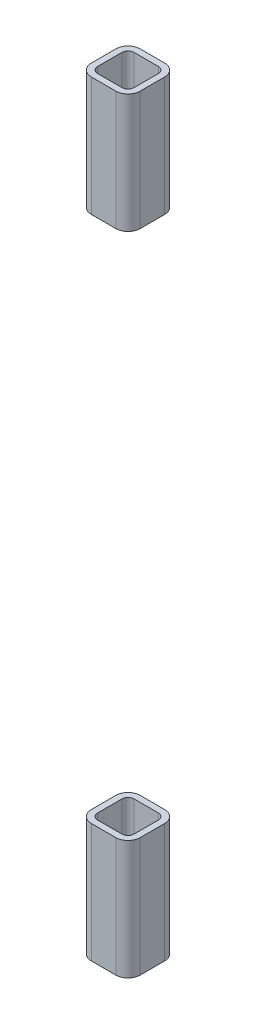
ISO-10303-21;
HEADER;
FILE_DESCRIPTION(('STEP AP214'),'2;1');
FILE_NAME('part.step','',(''),(''),'','','');
FILE_SCHEMA(('AUTOMOTIVE_DESIGN { 1 0 10303 214 1 1 1 1 }'));
ENDSEC;
DATA;
#1=APPLICATION_CONTEXT('core data for automotive mechanical design processes');
#2=APPLICATION_PROTOCOL_DEFINITION('international standard','automotive_design',2000,#1);
#3=PRODUCT_CONTEXT('',#1,'mechanical');
#4=PRODUCT('Part','Part','',(#3));
#5=PRODUCT_RELATED_PRODUCT_CATEGORY('part','',(#4));
#6=PRODUCT_DEFINITION_FORMATION('','',#4);
#7=PRODUCT_DEFINITION_CONTEXT('part definition',#1,'design');
#8=PRODUCT_DEFINITION('design','',#6,#7);
#9=PRODUCT_DEFINITION_SHAPE('','',#8);
#10=(LENGTH_UNIT() NAMED_UNIT(*) SI_UNIT(.MILLI.,.METRE.));
#11=(NAMED_UNIT(*) PLANE_ANGLE_UNIT() SI_UNIT($,.RADIAN.));
#12=(NAMED_UNIT(*) SI_UNIT($,.STERADIAN.) SOLID_ANGLE_UNIT());
#13=UNCERTAINTY_MEASURE_WITH_UNIT(LENGTH_MEASURE(1.E-05),#10,'distance_accuracy_value','');
#14=(GEOMETRIC_REPRESENTATION_CONTEXT(3) GLOBAL_UNCERTAINTY_ASSIGNED_CONTEXT((#13)) GLOBAL_UNIT_ASSIGNED_CONTEXT((#10,
#11,#12)) REPRESENTATION_CONTEXT('',''));
#15=CARTESIAN_POINT('',(0.,0.,0.));
#16=DIRECTION('',(0.,0.,1.));
#17=DIRECTION('',(1.,0.,0.));
#18=AXIS2_PLACEMENT_3D('',#15,#16,#17);
#19=CARTESIAN_POINT('',(-12.7,798.4,12.7));
#20=DIRECTION('',(0.,-1.,0.));
#21=DIRECTION('',(0.,0.,-1.));
#22=AXIS2_PLACEMENT_3D('',#19,#20,#21);
#23=CYLINDRICAL_SURFACE('',#22,12.7);
#24=DIRECTION('',(0.,-1.,0.));
#25=VECTOR('',#24,1.);
#26=CARTESIAN_POINT('',(-25.4,798.4,12.7));
#27=LINE('',#26,#25);
#28=CARTESIAN_POINT('',(-25.4,798.4,12.7));
#29=VERTEX_POINT('',#28);
#30=CARTESIAN_POINT('',(-25.4,674.2,12.7));
#31=VERTEX_POINT('',#30);
#32=EDGE_CURVE('E220',#29,#31,#27,.T.);
#33=ORIENTED_EDGE('',*,*,#32,.T.);
#34=CARTESIAN_POINT('',(-12.7,674.2,12.7));
#35=DIRECTION('',(0.,1.,0.));
#36=DIRECTION('',(0.,0.,1.));
#37=AXIS2_PLACEMENT_3D('',#34,#35,#36);
#38=CIRCLE('',#37,12.7);
#39=CARTESIAN_POINT('',(-12.7,674.2,25.4));
#40=VERTEX_POINT('',#39);
#41=EDGE_CURVE('E91',#31,#40,#38,.T.);
#42=ORIENTED_EDGE('',*,*,#41,.T.);
#43=DIRECTION('',(0.,-1.,0.));
#44=VECTOR('',#43,1.);
#45=CARTESIAN_POINT('',(-12.7,798.4,25.4));
#46=LINE('',#45,#44);
#47=CARTESIAN_POINT('',(-12.7,798.4,25.4));
#48=VERTEX_POINT('',#47);
#49=EDGE_CURVE('E273',#48,#40,#46,.T.);
#50=ORIENTED_EDGE('',*,*,#49,.F.);
#51=CARTESIAN_POINT('',(-12.7,798.4,12.7));
#52=DIRECTION('',(0.,1.,0.));
#53=DIRECTION('',(0.,0.,1.));
#54=AXIS2_PLACEMENT_3D('',#51,#52,#53);
#55=CIRCLE('',#54,12.7);
#56=EDGE_CURVE('E255',#29,#48,#55,.T.);
#57=ORIENTED_EDGE('',*,*,#56,.F.);
#58=EDGE_LOOP('',(#33,#42,#50,#57));
#59=FACE_BOUND('',#58,.T.);
#60=ADVANCED_FACE('F74',(#59),#23,.T.);
#61=CARTESIAN_POINT('',(-12.7,798.4,25.4));
#62=DIRECTION('',(0.,0.,-1.));
#63=DIRECTION('',(-1.,0.,0.));
#64=AXIS2_PLACEMENT_3D('',#61,#62,#63);
#65=PLANE('',#64);
#66=ORIENTED_EDGE('',*,*,#49,.T.);
#67=DIRECTION('',(-1.,0.,0.));
#68=VECTOR('',#67,1.);
#69=CARTESIAN_POINT('',(0.,674.2,25.4));
#70=LINE('',#69,#68);
#71=CARTESIAN_POINT('',(12.7,674.2,25.4));
#72=VERTEX_POINT('',#71);
#73=EDGE_CURVE('E13',#72,#40,#70,.T.);
#74=ORIENTED_EDGE('',*,*,#73,.F.);
#75=DIRECTION('',(0.,-1.,0.));
#76=VECTOR('',#75,1.);
#77=CARTESIAN_POINT('',(12.7,798.4,25.4));
#78=LINE('',#77,#76);
#79=CARTESIAN_POINT('',(12.7,798.4,25.4));
#80=VERTEX_POINT('',#79);
#81=EDGE_CURVE('E274',#80,#72,#78,.T.);
#82=ORIENTED_EDGE('',*,*,#81,.F.);
#83=DIRECTION('',(1.,0.,0.));
#84=VECTOR('',#83,1.);
#85=CARTESIAN_POINT('',(-12.7,798.4,25.4));
#86=LINE('',#85,#84);
#87=EDGE_CURVE('E306',#48,#80,#86,.T.);
#88=ORIENTED_EDGE('',*,*,#87,.F.);
#89=EDGE_LOOP('',(#66,#74,#82,#88));
#90=FACE_BOUND('',#89,.T.);
#91=ADVANCED_FACE('F305',(#90),#65,.F.);
#92=CARTESIAN_POINT('',(12.7,798.4,12.7));
#93=DIRECTION('',(0.,-1.,0.));
#94=DIRECTION('',(0.,0.,-1.));
#95=AXIS2_PLACEMENT_3D('',#92,#93,#94);
#96=CYLINDRICAL_SURFACE('',#95,12.7);
#97=ORIENTED_EDGE('',*,*,#81,.T.);
#98=CARTESIAN_POINT('',(12.7,674.2,12.7));
#99=DIRECTION('',(0.,1.,0.));
#100=DIRECTION('',(0.,0.,1.));
#101=AXIS2_PLACEMENT_3D('',#98,#99,#100);
#102=CIRCLE('',#101,12.7);
#103=CARTESIAN_POINT('',(25.3999999999999,674.2,12.7));
#104=VERTEX_POINT('',#103);
#105=EDGE_CURVE('E206',#72,#104,#102,.T.);
#106=ORIENTED_EDGE('',*,*,#105,.T.);
#107=DIRECTION('',(0.,-1.,0.));
#108=VECTOR('',#107,1.);
#109=CARTESIAN_POINT('',(25.4,798.4,12.7));
#110=LINE('',#109,#108);
#111=CARTESIAN_POINT('',(25.4,798.4,12.7));
#112=VERTEX_POINT('',#111);
#113=EDGE_CURVE('E200',#112,#104,#110,.T.);
#114=ORIENTED_EDGE('',*,*,#113,.F.);
#115=CARTESIAN_POINT('',(12.7,798.4,12.7));
#116=DIRECTION('',(0.,1.,0.));
#117=DIRECTION('',(0.,0.,1.));
#118=AXIS2_PLACEMENT_3D('',#115,#116,#117);
#119=CIRCLE('',#118,12.7);
#120=EDGE_CURVE('E302',#80,#112,#119,.T.);
#121=ORIENTED_EDGE('',*,*,#120,.F.);
#122=EDGE_LOOP('',(#97,#106,#114,#121));
#123=FACE_BOUND('',#122,.T.);
#124=ADVANCED_FACE('F301',(#123),#96,.T.);
#125=CARTESIAN_POINT('',(25.4,798.4,-12.7));
#126=DIRECTION('',(-1.,0.,0.));
#127=DIRECTION('',(0.,0.,1.));
#128=AXIS2_PLACEMENT_3D('',#125,#126,#127);
#129=PLANE('',#128);
#130=ORIENTED_EDGE('',*,*,#113,.T.);
#131=DIRECTION('',(0.,0.,1.));
#132=VECTOR('',#131,1.);
#133=CARTESIAN_POINT('',(25.3999999999999,674.2,-75.6));
#134=LINE('',#133,#132);
#135=CARTESIAN_POINT('',(25.3999999999999,674.2,-12.7));
#136=VERTEX_POINT('',#135);
#137=EDGE_CURVE('E83',#136,#104,#134,.T.);
#138=ORIENTED_EDGE('',*,*,#137,.F.);
#139=DIRECTION('',(0.,-1.,0.));
#140=VECTOR('',#139,1.);
#141=CARTESIAN_POINT('',(25.4,798.4,-12.7));
#142=LINE('',#141,#140);
#143=CARTESIAN_POINT('',(25.4,798.4,-12.7));
#144=VERTEX_POINT('',#143);
#145=EDGE_CURVE('E191',#144,#136,#142,.T.);
#146=ORIENTED_EDGE('',*,*,#145,.F.);
#147=DIRECTION('',(0.,0.,-1.));
#148=VECTOR('',#147,1.);
#149=CARTESIAN_POINT('',(25.4,798.4,-12.7));
#150=LINE('',#149,#148);
#151=EDGE_CURVE('E324',#112,#144,#150,.T.);
#152=ORIENTED_EDGE('',*,*,#151,.F.);
#153=EDGE_LOOP('',(#130,#138,#146,#152));
#154=FACE_BOUND('',#153,.T.);
#155=ADVANCED_FACE('F196',(#154),#129,.F.);
#156=CARTESIAN_POINT('',(12.7,798.4,-12.7));
#157=DIRECTION('',(0.,-1.,0.));
#158=DIRECTION('',(0.,0.,-1.));
#159=AXIS2_PLACEMENT_3D('',#156,#157,#158);
#160=CYLINDRICAL_SURFACE('',#159,12.7);
#161=ORIENTED_EDGE('',*,*,#145,.T.);
#162=CARTESIAN_POINT('',(12.7,674.2,-12.7));
#163=DIRECTION('',(0.,1.,0.));
#164=DIRECTION('',(0.,0.,1.));
#165=AXIS2_PLACEMENT_3D('',#162,#163,#164);
#166=CIRCLE('',#165,12.7);
#167=CARTESIAN_POINT('',(12.7,674.2,-25.4));
#168=VERTEX_POINT('',#167);
#169=EDGE_CURVE('E179',#136,#168,#166,.T.);
#170=ORIENTED_EDGE('',*,*,#169,.T.);
#171=DIRECTION('',(0.,-1.,0.));
#172=VECTOR('',#171,1.);
#173=CARTESIAN_POINT('',(12.7,798.4,-25.4));
#174=LINE('',#173,#172);
#175=CARTESIAN_POINT('',(12.7,798.4,-25.4));
#176=VERTEX_POINT('',#175);
#177=EDGE_CURVE('E190',#176,#168,#174,.T.);
#178=ORIENTED_EDGE('',*,*,#177,.F.);
#179=CARTESIAN_POINT('',(12.7,798.4,-12.7));
#180=DIRECTION('',(0.,1.,0.));
#181=DIRECTION('',(0.,0.,1.));
#182=AXIS2_PLACEMENT_3D('',#179,#180,#181);
#183=CIRCLE('',#182,12.7);
#184=EDGE_CURVE('E204',#144,#176,#183,.T.);
#185=ORIENTED_EDGE('',*,*,#184,.F.);
#186=EDGE_LOOP('',(#161,#170,#178,#185));
#187=FACE_BOUND('',#186,.T.);
#188=ADVANCED_FACE('F203',(#187),#160,.T.);
#189=CARTESIAN_POINT('',(12.7,798.4,-25.4));
#190=DIRECTION('',(0.,0.,1.));
#191=DIRECTION('',(1.,0.,0.));
#192=AXIS2_PLACEMENT_3D('',#189,#190,#191);
#193=PLANE('',#192);
#194=ORIENTED_EDGE('',*,*,#177,.T.);
#195=DIRECTION('',(-1.,0.,0.));
#196=VECTOR('',#195,1.);
#197=CARTESIAN_POINT('',(12.7,674.2,-25.4));
#198=LINE('',#197,#196);
#199=CARTESIAN_POINT('',(-12.7,674.2,-25.4));
#200=VERTEX_POINT('',#199);
#201=EDGE_CURVE('E185',#168,#200,#198,.T.);
#202=ORIENTED_EDGE('',*,*,#201,.T.);
#203=DIRECTION('',(0.,-1.,0.));
#204=VECTOR('',#203,1.);
#205=CARTESIAN_POINT('',(-12.7,798.4,-25.4));
#206=LINE('',#205,#204);
#207=CARTESIAN_POINT('',(-12.7,798.4,-25.4));
#208=VERTEX_POINT('',#207);
#209=EDGE_CURVE('E211',#208,#200,#206,.T.);
#210=ORIENTED_EDGE('',*,*,#209,.F.);
#211=DIRECTION('',(-1.,0.,0.));
#212=VECTOR('',#211,1.);
#213=CARTESIAN_POINT('',(12.7,798.4,-25.4));
#214=LINE('',#213,#212);
#215=EDGE_CURVE('E321',#176,#208,#214,.T.);
#216=ORIENTED_EDGE('',*,*,#215,.F.);
#217=EDGE_LOOP('',(#194,#202,#210,#216));
#218=FACE_BOUND('',#217,.T.);
#219=ADVANCED_FACE('F334',(#218),#193,.F.);
#220=CARTESIAN_POINT('',(-12.7,798.4,-12.7));
#221=DIRECTION('',(0.,-1.,0.));
#222=DIRECTION('',(0.,0.,-1.));
#223=AXIS2_PLACEMENT_3D('',#220,#221,#222);
#224=CYLINDRICAL_SURFACE('',#223,12.7);
#225=ORIENTED_EDGE('',*,*,#209,.T.);
#226=CARTESIAN_POINT('',(-12.7,674.2,-12.7));
#227=DIRECTION('',(0.,1.,0.));
#228=DIRECTION('',(0.,0.,1.));
#229=AXIS2_PLACEMENT_3D('',#226,#227,#228);
#230=CIRCLE('',#229,12.7);
#231=CARTESIAN_POINT('',(-25.4,674.2,-12.7));
#232=VERTEX_POINT('',#231);
#233=EDGE_CURVE('E214',#200,#232,#230,.T.);
#234=ORIENTED_EDGE('',*,*,#233,.T.);
#235=DIRECTION('',(0.,-1.,0.));
#236=VECTOR('',#235,1.);
#237=CARTESIAN_POINT('',(-25.4,798.4,-12.7));
#238=LINE('',#237,#236);
#239=CARTESIAN_POINT('',(-25.4,798.4,-12.7));
#240=VERTEX_POINT('',#239);
#241=EDGE_CURVE('E215',#240,#232,#238,.T.);
#242=ORIENTED_EDGE('',*,*,#241,.F.);
#243=CARTESIAN_POINT('',(-12.7,798.4,-12.7));
#244=DIRECTION('',(0.,1.,0.));
#245=DIRECTION('',(0.,0.,1.));
#246=AXIS2_PLACEMENT_3D('',#243,#244,#245);
#247=CIRCLE('',#246,12.7);
#248=EDGE_CURVE('E319',#208,#240,#247,.T.);
#249=ORIENTED_EDGE('',*,*,#248,.F.);
#250=EDGE_LOOP('',(#225,#234,#242,#249));
#251=FACE_BOUND('',#250,.T.);
#252=ADVANCED_FACE('F332',(#251),#224,.T.);
#253=CARTESIAN_POINT('',(12.7,798.4,12.7));
#254=DIRECTION('',(0.,-1.,0.));
#255=DIRECTION('',(0.,0.,-1.));
#256=AXIS2_PLACEMENT_3D('',#253,#254,#255);
#257=CYLINDRICAL_SURFACE('',#256,6.35);
#258=CARTESIAN_POINT('',(12.7,674.2,12.7));
#259=DIRECTION('',(0.,1.,0.));
#260=DIRECTION('',(0.,0.,1.));
#261=AXIS2_PLACEMENT_3D('',#258,#259,#260);
#262=CIRCLE('',#261,6.35);
#263=CARTESIAN_POINT('',(12.7,674.2,19.05));
#264=VERTEX_POINT('',#263);
#265=CARTESIAN_POINT('',(19.05,674.2,12.7));
#266=VERTEX_POINT('',#265);
#267=EDGE_CURVE('E279',#264,#266,#262,.T.);
#268=ORIENTED_EDGE('',*,*,#267,.F.);
#269=DIRECTION('',(0.,-1.,0.));
#270=VECTOR('',#269,1.);
#271=CARTESIAN_POINT('',(12.7,798.4,19.05));
#272=LINE('',#271,#270);
#273=CARTESIAN_POINT('',(12.7,798.4,19.05));
#274=VERTEX_POINT('',#273);
#275=EDGE_CURVE('E223',#274,#264,#272,.T.);
#276=ORIENTED_EDGE('',*,*,#275,.F.);
#277=CARTESIAN_POINT('',(12.7,798.4,12.7));
#278=DIRECTION('',(0.,1.,0.));
#279=DIRECTION('',(0.,0.,1.));
#280=AXIS2_PLACEMENT_3D('',#277,#278,#279);
#281=CIRCLE('',#280,6.35);
#282=CARTESIAN_POINT('',(19.05,798.4,12.7));
#283=VERTEX_POINT('',#282);
#284=EDGE_CURVE('E269',#274,#283,#281,.T.);
#285=ORIENTED_EDGE('',*,*,#284,.T.);
#286=DIRECTION('',(0.,-1.,0.));
#287=VECTOR('',#286,1.);
#288=CARTESIAN_POINT('',(19.05,798.4,12.7));
#289=LINE('',#288,#287);
#290=EDGE_CURVE('E77',#283,#266,#289,.T.);
#291=ORIENTED_EDGE('',*,*,#290,.T.);
#292=EDGE_LOOP('',(#268,#276,#285,#291));
#293=FACE_BOUND('',#292,.T.);
#294=ADVANCED_FACE('F341',(#293),#257,.F.);
#295=CARTESIAN_POINT('',(-12.7,798.4,19.05));
#296=DIRECTION('',(0.,0.,-1.));
#297=DIRECTION('',(-1.,0.,0.));
#298=AXIS2_PLACEMENT_3D('',#295,#296,#297);
#299=PLANE('',#298);
#300=DIRECTION('',(1.,0.,0.));
#301=VECTOR('',#300,1.);
#302=CARTESIAN_POINT('',(-12.7,674.2,19.05));
#303=LINE('',#302,#301);
#304=CARTESIAN_POINT('',(-12.7,674.2,19.05));
#305=VERTEX_POINT('',#304);
#306=EDGE_CURVE('E201',#305,#264,#303,.T.);
#307=ORIENTED_EDGE('',*,*,#306,.F.);
#308=DIRECTION('',(0.,-1.,0.));
#309=VECTOR('',#308,1.);
#310=CARTESIAN_POINT('',(-12.7,798.4,19.05));
#311=LINE('',#310,#309);
#312=CARTESIAN_POINT('',(-12.7,798.4,19.05));
#313=VERTEX_POINT('',#312);
#314=EDGE_CURVE('E228',#313,#305,#311,.T.);
#315=ORIENTED_EDGE('',*,*,#314,.F.);
#316=DIRECTION('',(1.,0.,0.));
#317=VECTOR('',#316,1.);
#318=CARTESIAN_POINT('',(-12.7,798.4,19.05));
#319=LINE('',#318,#317);
#320=EDGE_CURVE('E227',#313,#274,#319,.T.);
#321=ORIENTED_EDGE('',*,*,#320,.T.);
#322=ORIENTED_EDGE('',*,*,#275,.T.);
#323=EDGE_LOOP('',(#307,#315,#321,#322));
#324=FACE_BOUND('',#323,.T.);
#325=ADVANCED_FACE('F383',(#324),#299,.T.);
#326=CARTESIAN_POINT('',(-12.7,798.4,12.7));
#327=DIRECTION('',(0.,-1.,0.));
#328=DIRECTION('',(0.,0.,-1.));
#329=AXIS2_PLACEMENT_3D('',#326,#327,#328);
#330=CYLINDRICAL_SURFACE('',#329,6.35);
#331=CARTESIAN_POINT('',(-12.7,674.2,12.7));
#332=DIRECTION('',(0.,1.,0.));
#333=DIRECTION('',(0.,0.,1.));
#334=AXIS2_PLACEMENT_3D('',#331,#332,#333);
#335=CIRCLE('',#334,6.35);
#336=CARTESIAN_POINT('',(-19.05,674.2,12.7));
#337=VERTEX_POINT('',#336);
#338=EDGE_CURVE('E285',#337,#305,#335,.T.);
#339=ORIENTED_EDGE('',*,*,#338,.F.);
#340=DIRECTION('',(0.,-1.,0.));
#341=VECTOR('',#340,1.);
#342=CARTESIAN_POINT('',(-19.05,798.4,12.7));
#343=LINE('',#342,#341);
#344=CARTESIAN_POINT('',(-19.05,798.4,12.7));
#345=VERTEX_POINT('',#344);
#346=EDGE_CURVE('E232',#345,#337,#343,.T.);
#347=ORIENTED_EDGE('',*,*,#346,.F.);
#348=CARTESIAN_POINT('',(-12.7,798.4,12.7));
#349=DIRECTION('',(0.,1.,0.));
#350=DIRECTION('',(0.,0.,1.));
#351=AXIS2_PLACEMENT_3D('',#348,#349,#350);
#352=CIRCLE('',#351,6.35);
#353=EDGE_CURVE('E226',#345,#313,#352,.T.);
#354=ORIENTED_EDGE('',*,*,#353,.T.);
#355=ORIENTED_EDGE('',*,*,#314,.T.);
#356=EDGE_LOOP('',(#339,#347,#354,#355));
#357=FACE_BOUND('',#356,.T.);
#358=ADVANCED_FACE('F393',(#357),#330,.F.);
#359=CARTESIAN_POINT('',(-19.05,798.4,12.7));
#360=DIRECTION('',(1.,0.,0.));
#361=DIRECTION('',(0.,0.,-1.));
#362=AXIS2_PLACEMENT_3D('',#359,#360,#361);
#363=PLANE('',#362);
#364=DIRECTION('',(0.,0.,1.));
#365=VECTOR('',#364,1.);
#366=CARTESIAN_POINT('',(-19.05,674.2,12.7));
#367=LINE('',#366,#365);
#368=CARTESIAN_POINT('',(-19.05,674.2,-12.7));
#369=VERTEX_POINT('',#368);
#370=EDGE_CURVE('E287',#369,#337,#367,.T.);
#371=ORIENTED_EDGE('',*,*,#370,.F.);
#372=DIRECTION('',(0.,-1.,0.));
#373=VECTOR('',#372,1.);
#374=CARTESIAN_POINT('',(-19.05,798.4,-12.7));
#375=LINE('',#374,#373);
#376=CARTESIAN_POINT('',(-19.05,798.4,-12.7));
#377=VERTEX_POINT('',#376);
#378=EDGE_CURVE('E236',#377,#369,#375,.T.);
#379=ORIENTED_EDGE('',*,*,#378,.F.);
#380=DIRECTION('',(0.,0.,1.));
#381=VECTOR('',#380,1.);
#382=CARTESIAN_POINT('',(-19.05,798.4,12.7));
#383=LINE('',#382,#381);
#384=EDGE_CURVE('E231',#377,#345,#383,.T.);
#385=ORIENTED_EDGE('',*,*,#384,.T.);
#386=ORIENTED_EDGE('',*,*,#346,.T.);
#387=EDGE_LOOP('',(#371,#379,#385,#386));
#388=FACE_BOUND('',#387,.T.);
#389=ADVANCED_FACE('F403',(#388),#363,.T.);
#390=CARTESIAN_POINT('',(-12.7,798.4,-12.7));
#391=DIRECTION('',(0.,-1.,0.));
#392=DIRECTION('',(0.,0.,-1.));
#393=AXIS2_PLACEMENT_3D('',#390,#391,#392);
#394=CYLINDRICAL_SURFACE('',#393,6.35);
#395=CARTESIAN_POINT('',(-12.7,674.2,-12.7));
#396=DIRECTION('',(0.,1.,0.));
#397=DIRECTION('',(0.,0.,1.));
#398=AXIS2_PLACEMENT_3D('',#395,#396,#397);
#399=CIRCLE('',#398,6.35);
#400=CARTESIAN_POINT('',(-12.7,674.2,-19.05));
#401=VERTEX_POINT('',#400);
#402=EDGE_CURVE('E289',#401,#369,#399,.T.);
#403=ORIENTED_EDGE('',*,*,#402,.F.);
#404=DIRECTION('',(0.,-1.,0.));
#405=VECTOR('',#404,1.);
#406=CARTESIAN_POINT('',(-12.7,798.4,-19.05));
#407=LINE('',#406,#405);
#408=CARTESIAN_POINT('',(-12.7,798.4,-19.05));
#409=VERTEX_POINT('',#408);
#410=EDGE_CURVE('E240',#409,#401,#407,.T.);
#411=ORIENTED_EDGE('',*,*,#410,.F.);
#412=CARTESIAN_POINT('',(-12.7,798.4,-12.7));
#413=DIRECTION('',(0.,1.,0.));
#414=DIRECTION('',(0.,0.,1.));
#415=AXIS2_PLACEMENT_3D('',#412,#413,#414);
#416=CIRCLE('',#415,6.35);
#417=EDGE_CURVE('E235',#409,#377,#416,.T.);
#418=ORIENTED_EDGE('',*,*,#417,.T.);
#419=ORIENTED_EDGE('',*,*,#378,.T.);
#420=EDGE_LOOP('',(#403,#411,#418,#419));
#421=FACE_BOUND('',#420,.T.);
#422=ADVANCED_FACE('F413',(#421),#394,.F.);
#423=CARTESIAN_POINT('',(12.7,798.4,-19.05));
#424=DIRECTION('',(0.,0.,1.));
#425=DIRECTION('',(1.,0.,0.));
#426=AXIS2_PLACEMENT_3D('',#423,#424,#425);
#427=PLANE('',#426);
#428=DIRECTION('',(-1.,0.,0.));
#429=VECTOR('',#428,1.);
#430=CARTESIAN_POINT('',(12.7,674.2,-19.05));
#431=LINE('',#430,#429);
#432=CARTESIAN_POINT('',(12.7,674.2,-19.05));
#433=VERTEX_POINT('',#432);
#434=EDGE_CURVE('E291',#433,#401,#431,.T.);
#435=ORIENTED_EDGE('',*,*,#434,.F.);
#436=DIRECTION('',(0.,-1.,0.));
#437=VECTOR('',#436,1.);
#438=CARTESIAN_POINT('',(12.7,798.4,-19.05));
#439=LINE('',#438,#437);
#440=CARTESIAN_POINT('',(12.7,798.4,-19.05));
#441=VERTEX_POINT('',#440);
#442=EDGE_CURVE('E244',#441,#433,#439,.T.);
#443=ORIENTED_EDGE('',*,*,#442,.F.);
#444=DIRECTION('',(-1.,0.,0.));
#445=VECTOR('',#444,1.);
#446=CARTESIAN_POINT('',(12.7,798.4,-19.05));
#447=LINE('',#446,#445);
#448=EDGE_CURVE('E239',#441,#409,#447,.T.);
#449=ORIENTED_EDGE('',*,*,#448,.T.);
#450=ORIENTED_EDGE('',*,*,#410,.T.);
#451=EDGE_LOOP('',(#435,#443,#449,#450));
#452=FACE_BOUND('',#451,.T.);
#453=ADVANCED_FACE('F423',(#452),#427,.T.);
#454=CARTESIAN_POINT('',(12.7,798.4,-12.7));
#455=DIRECTION('',(0.,-1.,0.));
#456=DIRECTION('',(0.,0.,-1.));
#457=AXIS2_PLACEMENT_3D('',#454,#455,#456);
#458=CYLINDRICAL_SURFACE('',#457,6.35);
#459=CARTESIAN_POINT('',(12.7,674.2,-12.7));
#460=DIRECTION('',(0.,1.,0.));
#461=DIRECTION('',(0.,0.,1.));
#462=AXIS2_PLACEMENT_3D('',#459,#460,#461);
#463=CIRCLE('',#462,6.35);
#464=CARTESIAN_POINT('',(19.05,674.2,-12.7));
#465=VERTEX_POINT('',#464);
#466=EDGE_CURVE('E293',#465,#433,#463,.T.);
#467=ORIENTED_EDGE('',*,*,#466,.F.);
#468=DIRECTION('',(0.,-1.,0.));
#469=VECTOR('',#468,1.);
#470=CARTESIAN_POINT('',(19.05,798.4,-12.7));
#471=LINE('',#470,#469);
#472=CARTESIAN_POINT('',(19.05,798.4,-12.7));
#473=VERTEX_POINT('',#472);
#474=EDGE_CURVE('E219',#473,#465,#471,.T.);
#475=ORIENTED_EDGE('',*,*,#474,.F.);
#476=CARTESIAN_POINT('',(12.7,798.4,-12.7));
#477=DIRECTION('',(0.,1.,0.));
#478=DIRECTION('',(0.,0.,1.));
#479=AXIS2_PLACEMENT_3D('',#476,#477,#478);
#480=CIRCLE('',#479,6.35);
#481=EDGE_CURVE('E243',#473,#441,#480,.T.);
#482=ORIENTED_EDGE('',*,*,#481,.T.);
#483=ORIENTED_EDGE('',*,*,#442,.T.);
#484=EDGE_LOOP('',(#467,#475,#482,#483));
#485=FACE_BOUND('',#484,.T.);
#486=ADVANCED_FACE('F433',(#485),#458,.F.);
#487=CARTESIAN_POINT('',(19.05,798.4,-12.7));
#488=DIRECTION('',(-1.,0.,0.));
#489=DIRECTION('',(0.,0.,1.));
#490=AXIS2_PLACEMENT_3D('',#487,#488,#489);
#491=PLANE('',#490);
#492=DIRECTION('',(0.,0.,-1.));
#493=VECTOR('',#492,1.);
#494=CARTESIAN_POINT('',(19.05,674.2,-12.7));
#495=LINE('',#494,#493);
#496=EDGE_CURVE('E282',#266,#465,#495,.T.);
#497=ORIENTED_EDGE('',*,*,#496,.F.);
#498=ORIENTED_EDGE('',*,*,#290,.F.);
#499=DIRECTION('',(0.,0.,-1.));
#500=VECTOR('',#499,1.);
#501=CARTESIAN_POINT('',(19.05,798.4,-12.7));
#502=LINE('',#501,#500);
#503=EDGE_CURVE('E246',#283,#473,#502,.T.);
#504=ORIENTED_EDGE('',*,*,#503,.T.);
#505=ORIENTED_EDGE('',*,*,#474,.T.);
#506=EDGE_LOOP('',(#497,#498,#504,#505));
#507=FACE_BOUND('',#506,.T.);
#508=ADVANCED_FACE('F443',(#507),#491,.T.);
#509=CARTESIAN_POINT('',(-25.4,798.4,12.7));
#510=DIRECTION('',(1.,0.,0.));
#511=DIRECTION('',(0.,0.,-1.));
#512=AXIS2_PLACEMENT_3D('',#509,#510,#511);
#513=PLANE('',#512);
#514=ORIENTED_EDGE('',*,*,#241,.T.);
#515=DIRECTION('',(0.,0.,1.));
#516=VECTOR('',#515,1.);
#517=CARTESIAN_POINT('',(-25.4,674.2,12.7));
#518=LINE('',#517,#516);
#519=EDGE_CURVE('E218',#232,#31,#518,.T.);
#520=ORIENTED_EDGE('',*,*,#519,.T.);
#521=ORIENTED_EDGE('',*,*,#32,.F.);
#522=DIRECTION('',(0.,0.,1.));
#523=VECTOR('',#522,1.);
#524=CARTESIAN_POINT('',(-25.4,798.4,12.7));
#525=LINE('',#524,#523);
#526=EDGE_CURVE('E283',#240,#29,#525,.T.);
#527=ORIENTED_EDGE('',*,*,#526,.F.);
#528=EDGE_LOOP('',(#514,#520,#521,#527));
#529=FACE_BOUND('',#528,.T.);
#530=ADVANCED_FACE('F314',(#529),#513,.F.);
#531=CARTESIAN_POINT('',(-12.7,798.4,12.7));
#532=DIRECTION('',(0.,1.,0.));
#533=DIRECTION('',(0.,0.,1.));
#534=AXIS2_PLACEMENT_3D('',#531,#532,#533);
#535=PLANE('',#534);
#536=ORIENTED_EDGE('',*,*,#284,.F.);
#537=ORIENTED_EDGE('',*,*,#320,.F.);
#538=ORIENTED_EDGE('',*,*,#353,.F.);
#539=ORIENTED_EDGE('',*,*,#384,.F.);
#540=ORIENTED_EDGE('',*,*,#417,.F.);
#541=ORIENTED_EDGE('',*,*,#448,.F.);
#542=ORIENTED_EDGE('',*,*,#481,.F.);
#543=ORIENTED_EDGE('',*,*,#503,.F.);
#544=EDGE_LOOP('',(#536,#537,#538,#539,#540,#541,#542,#543));
#545=FACE_BOUND('',#544,.T.);
#546=ORIENTED_EDGE('',*,*,#56,.T.);
#547=ORIENTED_EDGE('',*,*,#87,.T.);
#548=ORIENTED_EDGE('',*,*,#120,.T.);
#549=ORIENTED_EDGE('',*,*,#151,.T.);
#550=ORIENTED_EDGE('',*,*,#184,.T.);
#551=ORIENTED_EDGE('',*,*,#215,.T.);
#552=ORIENTED_EDGE('',*,*,#248,.T.);
#553=ORIENTED_EDGE('',*,*,#526,.T.);
#554=EDGE_LOOP('',(#546,#547,#548,#549,#550,#551,#552,#553));
#555=FACE_BOUND('',#554,.T.);
#556=ADVANCED_FACE('F327',(#545,#555),#535,.T.);
#557=CARTESIAN_POINT('',(0.,674.2,-75.6));
#558=DIRECTION('',(0.,1.,0.));
#559=DIRECTION('',(0.,0.,1.));
#560=AXIS2_PLACEMENT_3D('',#557,#558,#559);
#561=PLANE('',#560);
#562=ORIENTED_EDGE('',*,*,#267,.T.);
#563=ORIENTED_EDGE('',*,*,#496,.T.);
#564=ORIENTED_EDGE('',*,*,#466,.T.);
#565=ORIENTED_EDGE('',*,*,#434,.T.);
#566=ORIENTED_EDGE('',*,*,#402,.T.);
#567=ORIENTED_EDGE('',*,*,#370,.T.);
#568=ORIENTED_EDGE('',*,*,#338,.T.);
#569=ORIENTED_EDGE('',*,*,#306,.T.);
#570=EDGE_LOOP('',(#562,#563,#564,#565,#566,#567,#568,#569));
#571=FACE_BOUND('',#570,.T.);
#572=ORIENTED_EDGE('',*,*,#519,.F.);
#573=ORIENTED_EDGE('',*,*,#233,.F.);
#574=ORIENTED_EDGE('',*,*,#201,.F.);
#575=ORIENTED_EDGE('',*,*,#169,.F.);
#576=ORIENTED_EDGE('',*,*,#137,.T.);
#577=ORIENTED_EDGE('',*,*,#105,.F.);
#578=ORIENTED_EDGE('',*,*,#73,.T.);
#579=ORIENTED_EDGE('',*,*,#41,.F.);
#580=EDGE_LOOP('',(#572,#573,#574,#575,#576,#577,#578,#579));
#581=FACE_BOUND('',#580,.T.);
#582=ADVANCED_FACE('F181',(#571,#581),#561,.F.);
#583=CLOSED_SHELL('',(#60,#91,#124,#155,#188,#219,#252,#294,#325,#358,#389,#422,#453,#486,#508,
#530,#556,#582));
#584=MANIFOLD_SOLID_BREP('B2',#583);
#585=CARTESIAN_POINT('',(19.05,798.4,-12.7));
#586=DIRECTION('',(-1.,0.,0.));
#587=DIRECTION('',(0.,0.,1.));
#588=AXIS2_PLACEMENT_3D('',#585,#586,#587);
#589=PLANE('',#588);
#590=DIRECTION('',(0.,0.,1.));
#591=VECTOR('',#590,1.);
#592=CARTESIAN_POINT('',(19.05,124.2,-12.7));
#593=LINE('',#592,#591);
#594=CARTESIAN_POINT('',(19.05,124.2,-12.7));
#595=VERTEX_POINT('',#594);
#596=CARTESIAN_POINT('',(19.05,124.2,12.7));
#597=VERTEX_POINT('',#596);
#598=EDGE_CURVE('E761',#595,#597,#593,.T.);
#599=ORIENTED_EDGE('',*,*,#598,.F.);
#600=DIRECTION('',(0.,-1.,0.));
#601=VECTOR('',#600,1.);
#602=CARTESIAN_POINT('',(19.05,798.4,-12.7));
#603=LINE('',#602,#601);
#604=CARTESIAN_POINT('',(19.05,0.,-12.7));
#605=VERTEX_POINT('',#604);
#606=EDGE_CURVE('E649',#595,#605,#603,.T.);
#607=ORIENTED_EDGE('',*,*,#606,.T.);
#608=DIRECTION('',(0.,0.,-1.));
#609=VECTOR('',#608,1.);
#610=CARTESIAN_POINT('',(19.05,0.,-12.7));
#611=LINE('',#610,#609);
#612=CARTESIAN_POINT('',(19.05,0.,12.7));
#613=VERTEX_POINT('',#612);
#614=EDGE_CURVE('E715',#613,#605,#611,.T.);
#615=ORIENTED_EDGE('',*,*,#614,.F.);
#616=DIRECTION('',(0.,-1.,0.));
#617=VECTOR('',#616,1.);
#618=CARTESIAN_POINT('',(19.05,798.4,12.7));
#619=LINE('',#618,#617);
#620=EDGE_CURVE('E647',#597,#613,#619,.T.);
#621=ORIENTED_EDGE('',*,*,#620,.F.);
#622=EDGE_LOOP('',(#599,#607,#615,#621));
#623=FACE_BOUND('',#622,.T.);
#624=ADVANCED_FACE('F509',(#623),#589,.T.);
#625=CARTESIAN_POINT('',(12.7,798.4,-12.7));
#626=DIRECTION('',(0.,-1.,0.));
#627=DIRECTION('',(0.,0.,-1.));
#628=AXIS2_PLACEMENT_3D('',#625,#626,#627);
#629=CYLINDRICAL_SURFACE('',#628,6.35);
#630=CARTESIAN_POINT('',(12.7,124.2,-12.7));
#631=DIRECTION('',(0.,-1.,0.));
#632=DIRECTION('',(0.,0.,-1.));
#633=AXIS2_PLACEMENT_3D('',#630,#631,#632);
#634=CIRCLE('',#633,6.35);
#635=CARTESIAN_POINT('',(12.7,124.2,-19.05));
#636=VERTEX_POINT('',#635);
#637=EDGE_CURVE('E524',#636,#595,#634,.T.);
#638=ORIENTED_EDGE('',*,*,#637,.F.);
#639=DIRECTION('',(0.,-1.,0.));
#640=VECTOR('',#639,1.);
#641=CARTESIAN_POINT('',(12.7,798.4,-19.05));
#642=LINE('',#641,#640);
#643=CARTESIAN_POINT('',(12.7,0.,-19.05));
#644=VERTEX_POINT('',#643);
#645=EDGE_CURVE('E652',#636,#644,#642,.T.);
#646=ORIENTED_EDGE('',*,*,#645,.T.);
#647=CARTESIAN_POINT('',(12.7,0.,-12.7));
#648=DIRECTION('',(0.,1.,0.));
#649=DIRECTION('',(0.,0.,1.));
#650=AXIS2_PLACEMENT_3D('',#647,#648,#649);
#651=CIRCLE('',#650,6.35);
#652=EDGE_CURVE('E718',#605,#644,#651,.T.);
#653=ORIENTED_EDGE('',*,*,#652,.F.);
#654=ORIENTED_EDGE('',*,*,#606,.F.);
#655=EDGE_LOOP('',(#638,#646,#653,#654));
#656=FACE_BOUND('',#655,.T.);
#657=ADVANCED_FACE('F794',(#656),#629,.F.);
#658=CARTESIAN_POINT('',(12.7,798.4,-19.05));
#659=DIRECTION('',(0.,0.,1.));
#660=DIRECTION('',(1.,0.,0.));
#661=AXIS2_PLACEMENT_3D('',#658,#659,#660);
#662=PLANE('',#661);
#663=DIRECTION('',(1.,0.,0.));
#664=VECTOR('',#663,1.);
#665=CARTESIAN_POINT('',(12.7,124.2,-19.05));
#666=LINE('',#665,#664);
#667=CARTESIAN_POINT('',(-12.7,124.2,-19.05));
#668=VERTEX_POINT('',#667);
#669=EDGE_CURVE('E758',#668,#636,#666,.T.);
#670=ORIENTED_EDGE('',*,*,#669,.F.);
#671=DIRECTION('',(0.,-1.,0.));
#672=VECTOR('',#671,1.);
#673=CARTESIAN_POINT('',(-12.7,798.4,-19.05));
#674=LINE('',#673,#672);
#675=CARTESIAN_POINT('',(-12.7,0.,-19.05));
#676=VERTEX_POINT('',#675);
#677=EDGE_CURVE('E654',#668,#676,#674,.T.);
#678=ORIENTED_EDGE('',*,*,#677,.T.);
#679=DIRECTION('',(-1.,0.,0.));
#680=VECTOR('',#679,1.);
#681=CARTESIAN_POINT('',(12.7,0.,-19.05));
#682=LINE('',#681,#680);
#683=EDGE_CURVE('E723',#644,#676,#682,.T.);
#684=ORIENTED_EDGE('',*,*,#683,.F.);
#685=ORIENTED_EDGE('',*,*,#645,.F.);
#686=EDGE_LOOP('',(#670,#678,#684,#685));
#687=FACE_BOUND('',#686,.T.);
#688=ADVANCED_FACE('F791',(#687),#662,.T.);
#689=CARTESIAN_POINT('',(-12.7,798.4,-12.7));
#690=DIRECTION('',(0.,-1.,0.));
#691=DIRECTION('',(0.,0.,-1.));
#692=AXIS2_PLACEMENT_3D('',#689,#690,#691);
#693=CYLINDRICAL_SURFACE('',#692,6.35);
#694=CARTESIAN_POINT('',(-12.7,124.2,-12.7));
#695=DIRECTION('',(0.,-1.,0.));
#696=DIRECTION('',(0.,0.,-1.));
#697=AXIS2_PLACEMENT_3D('',#694,#695,#696);
#698=CIRCLE('',#697,6.35);
#699=CARTESIAN_POINT('',(-19.05,124.2,-12.7));
#700=VERTEX_POINT('',#699);
#701=EDGE_CURVE('E756',#700,#668,#698,.T.);
#702=ORIENTED_EDGE('',*,*,#701,.F.);
#703=DIRECTION('',(0.,-1.,0.));
#704=VECTOR('',#703,1.);
#705=CARTESIAN_POINT('',(-19.05,798.4,-12.7));
#706=LINE('',#705,#704);
#707=CARTESIAN_POINT('',(-19.05,0.,-12.7));
#708=VERTEX_POINT('',#707);
#709=EDGE_CURVE('E656',#700,#708,#706,.T.);
#710=ORIENTED_EDGE('',*,*,#709,.T.);
#711=CARTESIAN_POINT('',(-12.7,0.,-12.7));
#712=DIRECTION('',(0.,1.,0.));
#713=DIRECTION('',(0.,0.,1.));
#714=AXIS2_PLACEMENT_3D('',#711,#712,#713);
#715=CIRCLE('',#714,6.35);
#716=EDGE_CURVE('E726',#676,#708,#715,.T.);
#717=ORIENTED_EDGE('',*,*,#716,.F.);
#718=ORIENTED_EDGE('',*,*,#677,.F.);
#719=EDGE_LOOP('',(#702,#710,#717,#718));
#720=FACE_BOUND('',#719,.T.);
#721=ADVANCED_FACE('F786',(#720),#693,.F.);
#722=CARTESIAN_POINT('',(-19.05,798.4,12.7));
#723=DIRECTION('',(1.,0.,0.));
#724=DIRECTION('',(0.,0.,-1.));
#725=AXIS2_PLACEMENT_3D('',#722,#723,#724);
#726=PLANE('',#725);
#727=DIRECTION('',(0.,0.,-1.));
#728=VECTOR('',#727,1.);
#729=CARTESIAN_POINT('',(-19.05,124.2,12.7));
#730=LINE('',#729,#728);
#731=CARTESIAN_POINT('',(-19.05,124.2,12.7));
#732=VERTEX_POINT('',#731);
#733=EDGE_CURVE('E754',#732,#700,#730,.T.);
#734=ORIENTED_EDGE('',*,*,#733,.F.);
#735=DIRECTION('',(0.,-1.,0.));
#736=VECTOR('',#735,1.);
#737=CARTESIAN_POINT('',(-19.05,798.4,12.7));
#738=LINE('',#737,#736);
#739=CARTESIAN_POINT('',(-19.05,0.,12.7));
#740=VERTEX_POINT('',#739);
#741=EDGE_CURVE('E658',#732,#740,#738,.T.);
#742=ORIENTED_EDGE('',*,*,#741,.T.);
#743=DIRECTION('',(0.,0.,1.));
#744=VECTOR('',#743,1.);
#745=CARTESIAN_POINT('',(-19.05,0.,12.7));
#746=LINE('',#745,#744);
#747=EDGE_CURVE('E729',#708,#740,#746,.T.);
#748=ORIENTED_EDGE('',*,*,#747,.F.);
#749=ORIENTED_EDGE('',*,*,#709,.F.);
#750=EDGE_LOOP('',(#734,#742,#748,#749));
#751=FACE_BOUND('',#750,.T.);
#752=ADVANCED_FACE('F782',(#751),#726,.T.);
#753=CARTESIAN_POINT('',(-12.7,798.4,12.7));
#754=DIRECTION('',(0.,-1.,0.));
#755=DIRECTION('',(0.,0.,-1.));
#756=AXIS2_PLACEMENT_3D('',#753,#754,#755);
#757=CYLINDRICAL_SURFACE('',#756,6.35);
#758=CARTESIAN_POINT('',(-12.7,124.2,12.7));
#759=DIRECTION('',(0.,-1.,0.));
#760=DIRECTION('',(0.,0.,-1.));
#761=AXIS2_PLACEMENT_3D('',#758,#759,#760);
#762=CIRCLE('',#761,6.35);
#763=CARTESIAN_POINT('',(-12.7,124.2,19.05));
#764=VERTEX_POINT('',#763);
#765=EDGE_CURVE('E752',#764,#732,#762,.T.);
#766=ORIENTED_EDGE('',*,*,#765,.F.);
#767=DIRECTION('',(0.,-1.,0.));
#768=VECTOR('',#767,1.);
#769=CARTESIAN_POINT('',(-12.7,798.4,19.05));
#770=LINE('',#769,#768);
#771=CARTESIAN_POINT('',(-12.7,0.,19.05));
#772=VERTEX_POINT('',#771);
#773=EDGE_CURVE('E660',#764,#772,#770,.T.);
#774=ORIENTED_EDGE('',*,*,#773,.T.);
#775=CARTESIAN_POINT('',(-12.7,0.,12.7));
#776=DIRECTION('',(0.,1.,0.));
#777=DIRECTION('',(0.,0.,1.));
#778=AXIS2_PLACEMENT_3D('',#775,#776,#777);
#779=CIRCLE('',#778,6.35);
#780=EDGE_CURVE('E732',#740,#772,#779,.T.);
#781=ORIENTED_EDGE('',*,*,#780,.F.);
#782=ORIENTED_EDGE('',*,*,#741,.F.);
#783=EDGE_LOOP('',(#766,#774,#781,#782));
#784=FACE_BOUND('',#783,.T.);
#785=ADVANCED_FACE('F776',(#784),#757,.F.);
#786=CARTESIAN_POINT('',(-12.7,798.4,19.05));
#787=DIRECTION('',(0.,0.,-1.));
#788=DIRECTION('',(-1.,0.,0.));
#789=AXIS2_PLACEMENT_3D('',#786,#787,#788);
#790=PLANE('',#789);
#791=DIRECTION('',(-1.,0.,0.));
#792=VECTOR('',#791,1.);
#793=CARTESIAN_POINT('',(-12.7,124.2,19.05));
#794=LINE('',#793,#792);
#795=CARTESIAN_POINT('',(12.7,124.2,19.05));
#796=VERTEX_POINT('',#795);
#797=EDGE_CURVE('E750',#796,#764,#794,.T.);
#798=ORIENTED_EDGE('',*,*,#797,.F.);
#799=DIRECTION('',(0.,-1.,0.));
#800=VECTOR('',#799,1.);
#801=CARTESIAN_POINT('',(12.7,798.4,19.05));
#802=LINE('',#801,#800);
#803=CARTESIAN_POINT('',(12.7,0.,19.05));
#804=VERTEX_POINT('',#803);
#805=EDGE_CURVE('E661',#796,#804,#802,.T.);
#806=ORIENTED_EDGE('',*,*,#805,.T.);
#807=DIRECTION('',(1.,0.,0.));
#808=VECTOR('',#807,1.);
#809=CARTESIAN_POINT('',(-12.7,0.,19.05));
#810=LINE('',#809,#808);
#811=EDGE_CURVE('E735',#772,#804,#810,.T.);
#812=ORIENTED_EDGE('',*,*,#811,.F.);
#813=ORIENTED_EDGE('',*,*,#773,.F.);
#814=EDGE_LOOP('',(#798,#806,#812,#813));
#815=FACE_BOUND('',#814,.T.);
#816=ADVANCED_FACE('F773',(#815),#790,.T.);
#817=CARTESIAN_POINT('',(12.7,798.4,12.7));
#818=DIRECTION('',(0.,-1.,0.));
#819=DIRECTION('',(0.,0.,-1.));
#820=AXIS2_PLACEMENT_3D('',#817,#818,#819);
#821=CYLINDRICAL_SURFACE('',#820,6.35);
#822=CARTESIAN_POINT('',(12.7,124.2,12.7));
#823=DIRECTION('',(0.,-1.,0.));
#824=DIRECTION('',(0.,0.,-1.));
#825=AXIS2_PLACEMENT_3D('',#822,#823,#824);
#826=CIRCLE('',#825,6.35);
#827=EDGE_CURVE('E748',#597,#796,#826,.T.);
#828=ORIENTED_EDGE('',*,*,#827,.F.);
#829=ORIENTED_EDGE('',*,*,#620,.T.);
#830=CARTESIAN_POINT('',(12.7,0.,12.7));
#831=DIRECTION('',(0.,1.,0.));
#832=DIRECTION('',(0.,0.,1.));
#833=AXIS2_PLACEMENT_3D('',#830,#831,#832);
#834=CIRCLE('',#833,6.35);
#835=EDGE_CURVE('E627',#804,#613,#834,.T.);
#836=ORIENTED_EDGE('',*,*,#835,.F.);
#837=ORIENTED_EDGE('',*,*,#805,.F.);
#838=EDGE_LOOP('',(#828,#829,#836,#837));
#839=FACE_BOUND('',#838,.T.);
#840=ADVANCED_FACE('F511',(#839),#821,.F.);
#841=CARTESIAN_POINT('',(-12.7,0.,12.7));
#842=DIRECTION('',(0.,1.,0.));
#843=DIRECTION('',(0.,0.,1.));
#844=AXIS2_PLACEMENT_3D('',#841,#842,#843);
#845=PLANE('',#844);
#846=ORIENTED_EDGE('',*,*,#835,.T.);
#847=ORIENTED_EDGE('',*,*,#614,.T.);
#848=ORIENTED_EDGE('',*,*,#652,.T.);
#849=ORIENTED_EDGE('',*,*,#683,.T.);
#850=ORIENTED_EDGE('',*,*,#716,.T.);
#851=ORIENTED_EDGE('',*,*,#747,.T.);
#852=ORIENTED_EDGE('',*,*,#780,.T.);
#853=ORIENTED_EDGE('',*,*,#811,.T.);
#854=EDGE_LOOP('',(#846,#847,#848,#849,#850,#851,#852,#853));
#855=FACE_BOUND('',#854,.T.);
#856=CARTESIAN_POINT('',(-12.7,0.,12.7));
#857=DIRECTION('',(0.,1.,0.));
#858=DIRECTION('',(0.,0.,1.));
#859=AXIS2_PLACEMENT_3D('',#856,#857,#858);
#860=CIRCLE('',#859,12.7);
#861=CARTESIAN_POINT('',(-25.4,0.,12.7));
#862=VERTEX_POINT('',#861);
#863=CARTESIAN_POINT('',(-12.7,0.,25.4));
#864=VERTEX_POINT('',#863);
#865=EDGE_CURVE('E641',#862,#864,#860,.T.);
#866=ORIENTED_EDGE('',*,*,#865,.F.);
#867=DIRECTION('',(0.,0.,1.));
#868=VECTOR('',#867,1.);
#869=CARTESIAN_POINT('',(-25.4,0.,12.7));
#870=LINE('',#869,#868);
#871=CARTESIAN_POINT('',(-25.4,0.,-12.7));
#872=VERTEX_POINT('',#871);
#873=EDGE_CURVE('E650',#872,#862,#870,.T.);
#874=ORIENTED_EDGE('',*,*,#873,.F.);
#875=CARTESIAN_POINT('',(-12.7,0.,-12.7));
#876=DIRECTION('',(0.,1.,0.));
#877=DIRECTION('',(0.,0.,1.));
#878=AXIS2_PLACEMENT_3D('',#875,#876,#877);
#879=CIRCLE('',#878,12.7);
#880=CARTESIAN_POINT('',(-12.7,0.,-25.4));
#881=VERTEX_POINT('',#880);
#882=EDGE_CURVE('E707',#881,#872,#879,.T.);
#883=ORIENTED_EDGE('',*,*,#882,.F.);
#884=DIRECTION('',(-1.,0.,0.));
#885=VECTOR('',#884,1.);
#886=CARTESIAN_POINT('',(12.7,0.,-25.4));
#887=LINE('',#886,#885);
#888=CARTESIAN_POINT('',(12.7,0.,-25.4));
#889=VERTEX_POINT('',#888);
#890=EDGE_CURVE('E702',#889,#881,#887,.T.);
#891=ORIENTED_EDGE('',*,*,#890,.F.);
#892=CARTESIAN_POINT('',(12.7,0.,-12.7));
#893=DIRECTION('',(0.,1.,0.));
#894=DIRECTION('',(0.,0.,1.));
#895=AXIS2_PLACEMENT_3D('',#892,#893,#894);
#896=CIRCLE('',#895,12.7);
#897=CARTESIAN_POINT('',(25.4,0.,-12.7));
#898=VERTEX_POINT('',#897);
#899=EDGE_CURVE('E700',#898,#889,#896,.T.);
#900=ORIENTED_EDGE('',*,*,#899,.F.);
#901=DIRECTION('',(0.,0.,-1.));
#902=VECTOR('',#901,1.);
#903=CARTESIAN_POINT('',(25.4,0.,-12.7));
#904=LINE('',#903,#902);
#905=CARTESIAN_POINT('',(25.4,0.,12.7));
#906=VERTEX_POINT('',#905);
#907=EDGE_CURVE('E688',#906,#898,#904,.T.);
#908=ORIENTED_EDGE('',*,*,#907,.F.);
#909=CARTESIAN_POINT('',(12.7,0.,12.7));
#910=DIRECTION('',(0.,1.,0.));
#911=DIRECTION('',(0.,0.,1.));
#912=AXIS2_PLACEMENT_3D('',#909,#910,#911);
#913=CIRCLE('',#912,12.7);
#914=CARTESIAN_POINT('',(12.7,0.,25.4));
#915=VERTEX_POINT('',#914);
#916=EDGE_CURVE('E692',#915,#906,#913,.T.);
#917=ORIENTED_EDGE('',*,*,#916,.F.);
#918=DIRECTION('',(1.,0.,0.));
#919=VECTOR('',#918,1.);
#920=CARTESIAN_POINT('',(-12.7,0.,25.4));
#921=LINE('',#920,#919);
#922=EDGE_CURVE('E695',#864,#915,#921,.T.);
#923=ORIENTED_EDGE('',*,*,#922,.F.);
#924=EDGE_LOOP('',(#866,#874,#883,#891,#900,#908,#917,#923));
#925=FACE_BOUND('',#924,.T.);
#926=ADVANCED_FACE('F697',(#855,#925),#845,.F.);
#927=CARTESIAN_POINT('',(-25.4,798.4,12.7));
#928=DIRECTION('',(1.,0.,0.));
#929=DIRECTION('',(0.,0.,-1.));
#930=AXIS2_PLACEMENT_3D('',#927,#928,#929);
#931=PLANE('',#930);
#932=DIRECTION('',(0.,-1.,0.));
#933=VECTOR('',#932,1.);
#934=CARTESIAN_POINT('',(-25.4,798.4,12.7));
#935=LINE('',#934,#933);
#936=CARTESIAN_POINT('',(-25.4,124.2,12.7));
#937=VERTEX_POINT('',#936);
#938=EDGE_CURVE('E662',#937,#862,#935,.T.);
#939=ORIENTED_EDGE('',*,*,#938,.F.);
#940=DIRECTION('',(0.,0.,-1.));
#941=VECTOR('',#940,1.);
#942=CARTESIAN_POINT('',(-25.4,124.2,12.7));
#943=LINE('',#942,#941);
#944=CARTESIAN_POINT('',(-25.4,124.2,-12.7));
#945=VERTEX_POINT('',#944);
#946=EDGE_CURVE('E72',#937,#945,#943,.T.);
#947=ORIENTED_EDGE('',*,*,#946,.T.);
#948=DIRECTION('',(0.,-1.,0.));
#949=VECTOR('',#948,1.);
#950=CARTESIAN_POINT('',(-25.4,798.4,-12.7));
#951=LINE('',#950,#949);
#952=EDGE_CURVE('E668',#945,#872,#951,.T.);
#953=ORIENTED_EDGE('',*,*,#952,.T.);
#954=ORIENTED_EDGE('',*,*,#873,.T.);
#955=EDGE_LOOP('',(#939,#947,#953,#954));
#956=FACE_BOUND('',#955,.T.);
#957=ADVANCED_FACE('F714',(#956),#931,.F.);
#958=CARTESIAN_POINT('',(-12.7,798.4,-12.7));
#959=DIRECTION('',(0.,-1.,0.));
#960=DIRECTION('',(0.,0.,-1.));
#961=AXIS2_PLACEMENT_3D('',#958,#959,#960);
#962=CYLINDRICAL_SURFACE('',#961,12.7);
#963=ORIENTED_EDGE('',*,*,#952,.F.);
#964=CARTESIAN_POINT('',(-12.7,124.2,-12.7));
#965=DIRECTION('',(0.,-1.,0.));
#966=DIRECTION('',(0.,0.,-1.));
#967=AXIS2_PLACEMENT_3D('',#964,#965,#966);
#968=CIRCLE('',#967,12.7);
#969=CARTESIAN_POINT('',(-12.7,124.2,-25.4));
#970=VERTEX_POINT('',#969);
#971=EDGE_CURVE('E532',#945,#970,#968,.T.);
#972=ORIENTED_EDGE('',*,*,#971,.T.);
#973=DIRECTION('',(0.,-1.,0.));
#974=VECTOR('',#973,1.);
#975=CARTESIAN_POINT('',(-12.7,798.4,-25.4));
#976=LINE('',#975,#974);
#977=EDGE_CURVE('E671',#970,#881,#976,.T.);
#978=ORIENTED_EDGE('',*,*,#977,.T.);
#979=ORIENTED_EDGE('',*,*,#882,.T.);
#980=EDGE_LOOP('',(#963,#972,#978,#979));
#981=FACE_BOUND('',#980,.T.);
#982=ADVANCED_FACE('F823',(#981),#962,.T.);
#983=CARTESIAN_POINT('',(12.7,798.4,-25.4));
#984=DIRECTION('',(0.,0.,1.));
#985=DIRECTION('',(1.,0.,0.));
#986=AXIS2_PLACEMENT_3D('',#983,#984,#985);
#987=PLANE('',#986);
#988=ORIENTED_EDGE('',*,*,#977,.F.);
#989=DIRECTION('',(1.,0.,0.));
#990=VECTOR('',#989,1.);
#991=CARTESIAN_POINT('',(12.7,124.2,-25.4));
#992=LINE('',#991,#990);
#993=CARTESIAN_POINT('',(12.7,124.2,-25.4));
#994=VERTEX_POINT('',#993);
#995=EDGE_CURVE('E744',#970,#994,#992,.T.);
#996=ORIENTED_EDGE('',*,*,#995,.T.);
#997=DIRECTION('',(0.,-1.,0.));
#998=VECTOR('',#997,1.);
#999=CARTESIAN_POINT('',(12.7,798.4,-25.4));
#1000=LINE('',#999,#998);
#1001=EDGE_CURVE('E677',#994,#889,#1000,.T.);
#1002=ORIENTED_EDGE('',*,*,#1001,.T.);
#1003=ORIENTED_EDGE('',*,*,#890,.T.);
#1004=EDGE_LOOP('',(#988,#996,#1002,#1003));
#1005=FACE_BOUND('',#1004,.T.);
#1006=ADVANCED_FACE('F828',(#1005),#987,.F.);
#1007=CARTESIAN_POINT('',(12.7,798.4,-12.7));
#1008=DIRECTION('',(0.,-1.,0.));
#1009=DIRECTION('',(0.,0.,-1.));
#1010=AXIS2_PLACEMENT_3D('',#1007,#1008,#1009);
#1011=CYLINDRICAL_SURFACE('',#1010,12.7);
#1012=ORIENTED_EDGE('',*,*,#1001,.F.);
#1013=CARTESIAN_POINT('',(12.7,124.2,-12.7));
#1014=DIRECTION('',(0.,-1.,0.));
#1015=DIRECTION('',(0.,0.,-1.));
#1016=AXIS2_PLACEMENT_3D('',#1013,#1014,#1015);
#1017=CIRCLE('',#1016,12.7);
#1018=CARTESIAN_POINT('',(25.3999999999997,124.2,-12.7));
#1019=VERTEX_POINT('',#1018);
#1020=EDGE_CURVE('E741',#994,#1019,#1017,.T.);
#1021=ORIENTED_EDGE('',*,*,#1020,.T.);
#1022=DIRECTION('',(0.,-1.,0.));
#1023=VECTOR('',#1022,1.);
#1024=CARTESIAN_POINT('',(25.4,798.4,-12.7));
#1025=LINE('',#1024,#1023);
#1026=EDGE_CURVE('E679',#1019,#898,#1025,.T.);
#1027=ORIENTED_EDGE('',*,*,#1026,.T.);
#1028=ORIENTED_EDGE('',*,*,#899,.T.);
#1029=EDGE_LOOP('',(#1012,#1021,#1027,#1028));
#1030=FACE_BOUND('',#1029,.T.);
#1031=ADVANCED_FACE('F831',(#1030),#1011,.T.);
#1032=CARTESIAN_POINT('',(25.4,798.4,-12.7));
#1033=DIRECTION('',(-1.,0.,0.));
#1034=DIRECTION('',(0.,0.,1.));
#1035=AXIS2_PLACEMENT_3D('',#1032,#1033,#1034);
#1036=PLANE('',#1035);
#1037=ORIENTED_EDGE('',*,*,#1026,.F.);
#1038=DIRECTION('',(0.,0.,1.));
#1039=VECTOR('',#1038,1.);
#1040=CARTESIAN_POINT('',(25.3999999999997,124.2,-75.6));
#1041=LINE('',#1040,#1039);
#1042=CARTESIAN_POINT('',(25.3999999999997,124.2,12.7));
#1043=VERTEX_POINT('',#1042);
#1044=EDGE_CURVE('E636',#1019,#1043,#1041,.T.);
#1045=ORIENTED_EDGE('',*,*,#1044,.T.);
#1046=DIRECTION('',(0.,-1.,0.));
#1047=VECTOR('',#1046,1.);
#1048=CARTESIAN_POINT('',(25.4,798.4,12.7));
#1049=LINE('',#1048,#1047);
#1050=EDGE_CURVE('E643',#1043,#906,#1049,.T.);
#1051=ORIENTED_EDGE('',*,*,#1050,.T.);
#1052=ORIENTED_EDGE('',*,*,#907,.T.);
#1053=EDGE_LOOP('',(#1037,#1045,#1051,#1052));
#1054=FACE_BOUND('',#1053,.T.);
#1055=ADVANCED_FACE('F686',(#1054),#1036,.F.);
#1056=CARTESIAN_POINT('',(12.7,798.4,12.7));
#1057=DIRECTION('',(0.,-1.,0.));
#1058=DIRECTION('',(0.,0.,-1.));
#1059=AXIS2_PLACEMENT_3D('',#1056,#1057,#1058);
#1060=CYLINDRICAL_SURFACE('',#1059,12.7);
#1061=ORIENTED_EDGE('',*,*,#1050,.F.);
#1062=CARTESIAN_POINT('',(12.7,124.2,12.7));
#1063=DIRECTION('',(0.,-1.,0.));
#1064=DIRECTION('',(0.,0.,-1.));
#1065=AXIS2_PLACEMENT_3D('',#1062,#1063,#1064);
#1066=CIRCLE('',#1065,12.7);
#1067=CARTESIAN_POINT('',(12.7,124.2,25.4));
#1068=VERTEX_POINT('',#1067);
#1069=EDGE_CURVE('E628',#1043,#1068,#1066,.T.);
#1070=ORIENTED_EDGE('',*,*,#1069,.T.);
#1071=DIRECTION('',(0.,-1.,0.));
#1072=VECTOR('',#1071,1.);
#1073=CARTESIAN_POINT('',(12.7,798.4,25.4));
#1074=LINE('',#1073,#1072);
#1075=EDGE_CURVE('E635',#1068,#915,#1074,.T.);
#1076=ORIENTED_EDGE('',*,*,#1075,.T.);
#1077=ORIENTED_EDGE('',*,*,#916,.T.);
#1078=EDGE_LOOP('',(#1061,#1070,#1076,#1077));
#1079=FACE_BOUND('',#1078,.T.);
#1080=ADVANCED_FACE('F693',(#1079),#1060,.T.);
#1081=CARTESIAN_POINT('',(-12.7,798.4,25.4));
#1082=DIRECTION('',(0.,0.,-1.));
#1083=DIRECTION('',(-1.,0.,0.));
#1084=AXIS2_PLACEMENT_3D('',#1081,#1082,#1083);
#1085=PLANE('',#1084);
#1086=ORIENTED_EDGE('',*,*,#1075,.F.);
#1087=DIRECTION('',(1.,0.,0.));
#1088=VECTOR('',#1087,1.);
#1089=CARTESIAN_POINT('',(0.,124.2,25.4));
#1090=LINE('',#1089,#1088);
#1091=CARTESIAN_POINT('',(-12.7,124.2,25.4));
#1092=VERTEX_POINT('',#1091);
#1093=EDGE_CURVE('E622',#1092,#1068,#1090,.T.);
#1094=ORIENTED_EDGE('',*,*,#1093,.F.);
#1095=DIRECTION('',(0.,-1.,0.));
#1096=VECTOR('',#1095,1.);
#1097=CARTESIAN_POINT('',(-12.7,798.4,25.4));
#1098=LINE('',#1097,#1096);
#1099=EDGE_CURVE('E517',#1092,#864,#1098,.T.);
#1100=ORIENTED_EDGE('',*,*,#1099,.T.);
#1101=ORIENTED_EDGE('',*,*,#922,.T.);
#1102=EDGE_LOOP('',(#1086,#1094,#1100,#1101));
#1103=FACE_BOUND('',#1102,.T.);
#1104=ADVANCED_FACE('F632',(#1103),#1085,.F.);
#1105=CARTESIAN_POINT('',(-12.7,798.4,12.7));
#1106=DIRECTION('',(0.,-1.,0.));
#1107=DIRECTION('',(0.,0.,-1.));
#1108=AXIS2_PLACEMENT_3D('',#1105,#1106,#1107);
#1109=CYLINDRICAL_SURFACE('',#1108,12.7);
#1110=ORIENTED_EDGE('',*,*,#1099,.F.);
#1111=CARTESIAN_POINT('',(-12.7,124.2,12.7));
#1112=DIRECTION('',(0.,-1.,0.));
#1113=DIRECTION('',(0.,0.,-1.));
#1114=AXIS2_PLACEMENT_3D('',#1111,#1112,#1113);
#1115=CIRCLE('',#1114,12.7);
#1116=EDGE_CURVE('E619',#1092,#937,#1115,.T.);
#1117=ORIENTED_EDGE('',*,*,#1116,.T.);
#1118=ORIENTED_EDGE('',*,*,#938,.T.);
#1119=ORIENTED_EDGE('',*,*,#865,.T.);
#1120=EDGE_LOOP('',(#1110,#1117,#1118,#1119));
#1121=FACE_BOUND('',#1120,.T.);
#1122=ADVANCED_FACE('F639',(#1121),#1109,.T.);
#1123=CARTESIAN_POINT('',(0.,124.2,-75.6));
#1124=DIRECTION('',(0.,-1.,0.));
#1125=DIRECTION('',(0.,0.,-1.));
#1126=AXIS2_PLACEMENT_3D('',#1123,#1124,#1125);
#1127=PLANE('',#1126);
#1128=ORIENTED_EDGE('',*,*,#827,.T.);
#1129=ORIENTED_EDGE('',*,*,#797,.T.);
#1130=ORIENTED_EDGE('',*,*,#765,.T.);
#1131=ORIENTED_EDGE('',*,*,#733,.T.);
#1132=ORIENTED_EDGE('',*,*,#701,.T.);
#1133=ORIENTED_EDGE('',*,*,#669,.T.);
#1134=ORIENTED_EDGE('',*,*,#637,.T.);
#1135=ORIENTED_EDGE('',*,*,#598,.T.);
#1136=EDGE_LOOP('',(#1128,#1129,#1130,#1131,#1132,#1133,#1134,#1135));
#1137=FACE_BOUND('',#1136,.T.);
#1138=ORIENTED_EDGE('',*,*,#1093,.T.);
#1139=ORIENTED_EDGE('',*,*,#1069,.F.);
#1140=ORIENTED_EDGE('',*,*,#1044,.F.);
#1141=ORIENTED_EDGE('',*,*,#1020,.F.);
#1142=ORIENTED_EDGE('',*,*,#995,.F.);
#1143=ORIENTED_EDGE('',*,*,#971,.F.);
#1144=ORIENTED_EDGE('',*,*,#946,.F.);
#1145=ORIENTED_EDGE('',*,*,#1116,.F.);
#1146=EDGE_LOOP('',(#1138,#1139,#1140,#1141,#1142,#1143,#1144,#1145));
#1147=FACE_BOUND('',#1146,.T.);
#1148=ADVANCED_FACE('F621',(#1137,#1147),#1127,.F.);
#1149=CLOSED_SHELL('',(#624,#657,#688,#721,#752,#785,#816,#840,#926,#957,#982,#1006,#1031,#1055,
#1080,#1104,#1122,#1148));
#1150=MANIFOLD_SOLID_BREP('B7',#1149);
#1151=ADVANCED_BREP_SHAPE_REPRESENTATION('',(#18,#584,#1150),#14);
#1152=SHAPE_DEFINITION_REPRESENTATION(#9,#1151);
ENDSEC;
END-ISO-10303-21;
